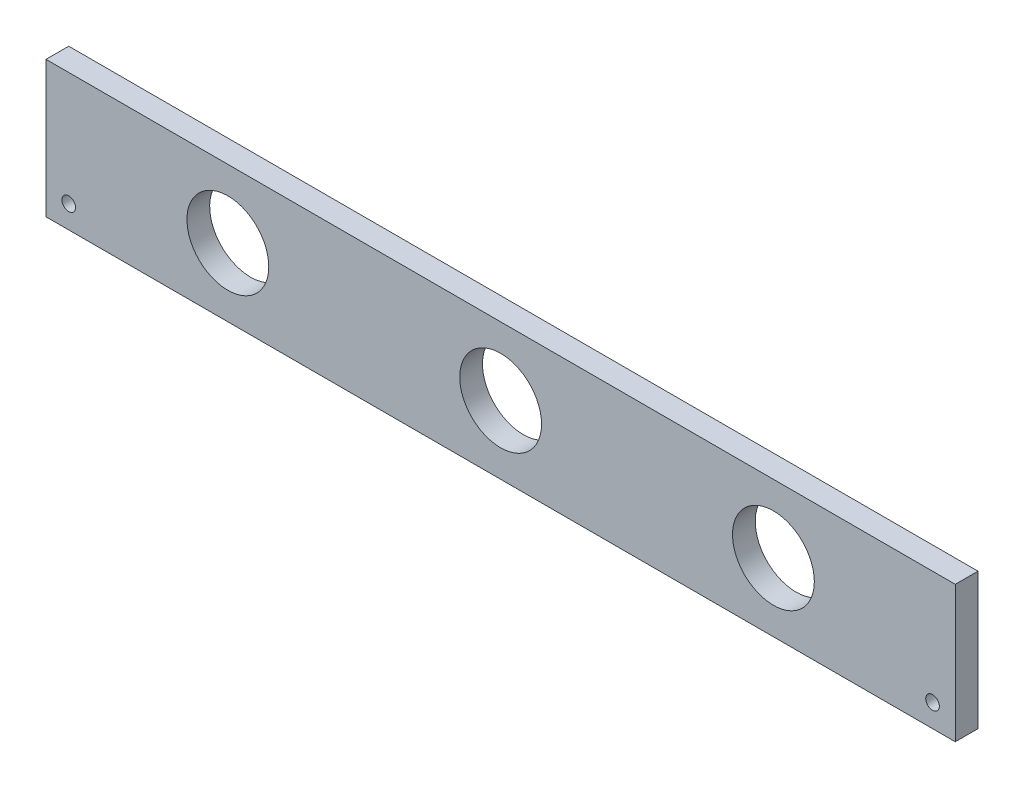
ISO-10303-21;
HEADER;
FILE_DESCRIPTION(('STEP AP214'),'2;1');
FILE_NAME('part.step','',(''),(''),'','','');
FILE_SCHEMA(('AUTOMOTIVE_DESIGN { 1 0 10303 214 1 1 1 1 }'));
ENDSEC;
DATA;
#1=APPLICATION_CONTEXT('core data for automotive mechanical design processes');
#2=APPLICATION_PROTOCOL_DEFINITION('international standard','automotive_design',2000,#1);
#3=PRODUCT_CONTEXT('',#1,'mechanical');
#4=PRODUCT('Part','Part','',(#3));
#5=PRODUCT_RELATED_PRODUCT_CATEGORY('part','',(#4));
#6=PRODUCT_DEFINITION_FORMATION('','',#4);
#7=PRODUCT_DEFINITION_CONTEXT('part definition',#1,'design');
#8=PRODUCT_DEFINITION('design','',#6,#7);
#9=PRODUCT_DEFINITION_SHAPE('','',#8);
#10=(LENGTH_UNIT() NAMED_UNIT(*) SI_UNIT(.MILLI.,.METRE.));
#11=(NAMED_UNIT(*) PLANE_ANGLE_UNIT() SI_UNIT($,.RADIAN.));
#12=(NAMED_UNIT(*) SI_UNIT($,.STERADIAN.) SOLID_ANGLE_UNIT());
#13=UNCERTAINTY_MEASURE_WITH_UNIT(LENGTH_MEASURE(1.E-05),#10,'distance_accuracy_value','');
#14=(GEOMETRIC_REPRESENTATION_CONTEXT(3) GLOBAL_UNCERTAINTY_ASSIGNED_CONTEXT((#13)) GLOBAL_UNIT_ASSIGNED_CONTEXT((#10,
#11,#12)) REPRESENTATION_CONTEXT('',''));
#15=CARTESIAN_POINT('',(0.,0.,0.));
#16=DIRECTION('',(0.,0.,1.));
#17=DIRECTION('',(1.,0.,0.));
#18=AXIS2_PLACEMENT_3D('',#15,#16,#17);
#19=CARTESIAN_POINT('',(100.,0.,-5.));
#20=DIRECTION('',(0.,0.,1.));
#21=DIRECTION('',(0.,-1.,0.));
#22=AXIS2_PLACEMENT_3D('',#19,#20,#21);
#23=PLANE('',#22);
#24=CARTESIAN_POINT('',(95.,5.,-5.));
#25=DIRECTION('',(0.,0.,1.));
#26=DIRECTION('',(0.,-1.,0.));
#27=AXIS2_PLACEMENT_3D('',#24,#25,#26);
#28=CIRCLE('',#27,1.5);
#29=CARTESIAN_POINT('',(95.,3.5,-5.));
#30=VERTEX_POINT('',#29);
#31=EDGE_CURVE('E133',#30,#30,#28,.T.);
#32=ORIENTED_EDGE('',*,*,#31,.T.);
#33=EDGE_LOOP('',(#32));
#34=FACE_BOUND('',#33,.T.);
#35=CARTESIAN_POINT('',(-95.,5.,-5.));
#36=DIRECTION('',(0.,0.,1.));
#37=DIRECTION('',(0.,-1.,0.));
#38=AXIS2_PLACEMENT_3D('',#35,#36,#37);
#39=CIRCLE('',#38,1.5);
#40=CARTESIAN_POINT('',(-95.,3.5,-5.));
#41=VERTEX_POINT('',#40);
#42=EDGE_CURVE('E127',#41,#41,#39,.T.);
#43=ORIENTED_EDGE('',*,*,#42,.T.);
#44=EDGE_LOOP('',(#43));
#45=FACE_BOUND('',#44,.T.);
#46=CARTESIAN_POINT('',(-60.,15.,-5.));
#47=DIRECTION('',(0.,0.,1.));
#48=DIRECTION('',(0.,-1.,0.));
#49=AXIS2_PLACEMENT_3D('',#46,#47,#48);
#50=CIRCLE('',#49,9.);
#51=CARTESIAN_POINT('',(-60.,6.,-5.));
#52=VERTEX_POINT('',#51);
#53=EDGE_CURVE('E121',#52,#52,#50,.T.);
#54=ORIENTED_EDGE('',*,*,#53,.T.);
#55=EDGE_LOOP('',(#54));
#56=FACE_BOUND('',#55,.T.);
#57=CARTESIAN_POINT('',(60.,15.,-5.));
#58=DIRECTION('',(0.,0.,1.));
#59=DIRECTION('',(0.,-1.,0.));
#60=AXIS2_PLACEMENT_3D('',#57,#58,#59);
#61=CIRCLE('',#60,9.);
#62=CARTESIAN_POINT('',(60.,6.,-5.));
#63=VERTEX_POINT('',#62);
#64=EDGE_CURVE('E115',#63,#63,#61,.T.);
#65=ORIENTED_EDGE('',*,*,#64,.T.);
#66=EDGE_LOOP('',(#65));
#67=FACE_BOUND('',#66,.T.);
#68=CARTESIAN_POINT('',(0.,15.,-5.));
#69=DIRECTION('',(0.,0.,1.));
#70=DIRECTION('',(0.,-1.,0.));
#71=AXIS2_PLACEMENT_3D('',#68,#69,#70);
#72=CIRCLE('',#71,9.);
#73=CARTESIAN_POINT('',(0.,6.,-5.));
#74=VERTEX_POINT('',#73);
#75=EDGE_CURVE('E99',#74,#74,#72,.T.);
#76=ORIENTED_EDGE('',*,*,#75,.T.);
#77=EDGE_LOOP('',(#76));
#78=FACE_BOUND('',#77,.T.);
#79=DIRECTION('',(0.,1.,0.));
#80=VECTOR('',#79,1.);
#81=CARTESIAN_POINT('',(-100.,0.,-5.));
#82=LINE('',#81,#80);
#83=CARTESIAN_POINT('',(-100.,0.,-5.));
#84=VERTEX_POINT('',#83);
#85=CARTESIAN_POINT('',(-100.,30.,-5.));
#86=VERTEX_POINT('',#85);
#87=EDGE_CURVE('E96',#84,#86,#82,.T.);
#88=ORIENTED_EDGE('',*,*,#87,.T.);
#89=DIRECTION('',(-1.,0.,0.));
#90=VECTOR('',#89,1.);
#91=CARTESIAN_POINT('',(100.,30.,-5.));
#92=LINE('',#91,#90);
#93=CARTESIAN_POINT('',(100.,30.,-5.));
#94=VERTEX_POINT('',#93);
#95=EDGE_CURVE('E11',#94,#86,#92,.T.);
#96=ORIENTED_EDGE('',*,*,#95,.F.);
#97=DIRECTION('',(0.,1.,0.));
#98=VECTOR('',#97,1.);
#99=CARTESIAN_POINT('',(100.,0.,-5.));
#100=LINE('',#99,#98);
#101=CARTESIAN_POINT('',(100.,0.,-5.));
#102=VERTEX_POINT('',#101);
#103=EDGE_CURVE('E84',#102,#94,#100,.T.);
#104=ORIENTED_EDGE('',*,*,#103,.F.);
#105=DIRECTION('',(-1.,0.,0.));
#106=VECTOR('',#105,1.);
#107=CARTESIAN_POINT('',(100.,0.,-5.));
#108=LINE('',#107,#106);
#109=EDGE_CURVE('E92',#102,#84,#108,.T.);
#110=ORIENTED_EDGE('',*,*,#109,.T.);
#111=EDGE_LOOP('',(#88,#96,#104,#110));
#112=FACE_BOUND('',#111,.T.);
#113=ADVANCED_FACE('F33',(#34,#45,#56,#67,#78,#112),#23,.F.);
#114=CARTESIAN_POINT('',(100.,30.,-5.));
#115=DIRECTION('',(0.,-1.,0.));
#116=DIRECTION('',(0.,0.,-1.));
#117=AXIS2_PLACEMENT_3D('',#114,#115,#116);
#118=PLANE('',#117);
#119=DIRECTION('',(0.,0.,1.));
#120=VECTOR('',#119,1.);
#121=CARTESIAN_POINT('',(-100.,30.,-5.));
#122=LINE('',#121,#120);
#123=CARTESIAN_POINT('',(-100.,30.,0.));
#124=VERTEX_POINT('',#123);
#125=EDGE_CURVE('E88',#86,#124,#122,.T.);
#126=ORIENTED_EDGE('',*,*,#125,.T.);
#127=DIRECTION('',(-1.,0.,0.));
#128=VECTOR('',#127,1.);
#129=CARTESIAN_POINT('',(100.,30.,0.));
#130=LINE('',#129,#128);
#131=CARTESIAN_POINT('',(100.,30.,0.));
#132=VERTEX_POINT('',#131);
#133=EDGE_CURVE('E41',#132,#124,#130,.T.);
#134=ORIENTED_EDGE('',*,*,#133,.F.);
#135=DIRECTION('',(0.,0.,1.));
#136=VECTOR('',#135,1.);
#137=CARTESIAN_POINT('',(100.,30.,-5.));
#138=LINE('',#137,#136);
#139=EDGE_CURVE('E79',#94,#132,#138,.T.);
#140=ORIENTED_EDGE('',*,*,#139,.F.);
#141=ORIENTED_EDGE('',*,*,#95,.T.);
#142=EDGE_LOOP('',(#126,#134,#140,#141));
#143=FACE_BOUND('',#142,.T.);
#144=ADVANCED_FACE('F87',(#143),#118,.F.);
#145=CARTESIAN_POINT('',(100.,30.,0.));
#146=DIRECTION('',(0.,0.,-1.));
#147=DIRECTION('',(-1.,0.,0.));
#148=AXIS2_PLACEMENT_3D('',#145,#146,#147);
#149=PLANE('',#148);
#150=CARTESIAN_POINT('',(95.,5.,0.));
#151=DIRECTION('',(0.,0.,1.));
#152=DIRECTION('',(1.,0.,0.));
#153=AXIS2_PLACEMENT_3D('',#150,#151,#152);
#154=CIRCLE('',#153,1.5);
#155=CARTESIAN_POINT('',(96.5,5.,0.));
#156=VERTEX_POINT('',#155);
#157=EDGE_CURVE('E136',#156,#156,#154,.T.);
#158=ORIENTED_EDGE('',*,*,#157,.F.);
#159=EDGE_LOOP('',(#158));
#160=FACE_BOUND('',#159,.T.);
#161=CARTESIAN_POINT('',(-95.,5.,0.));
#162=DIRECTION('',(0.,0.,1.));
#163=DIRECTION('',(1.,0.,0.));
#164=AXIS2_PLACEMENT_3D('',#161,#162,#163);
#165=CIRCLE('',#164,1.5);
#166=CARTESIAN_POINT('',(-93.5,5.,0.));
#167=VERTEX_POINT('',#166);
#168=EDGE_CURVE('E130',#167,#167,#165,.T.);
#169=ORIENTED_EDGE('',*,*,#168,.F.);
#170=EDGE_LOOP('',(#169));
#171=FACE_BOUND('',#170,.T.);
#172=CARTESIAN_POINT('',(-60.,15.,0.));
#173=DIRECTION('',(0.,0.,1.));
#174=DIRECTION('',(1.,0.,0.));
#175=AXIS2_PLACEMENT_3D('',#172,#173,#174);
#176=CIRCLE('',#175,9.);
#177=CARTESIAN_POINT('',(-51.,15.,0.));
#178=VERTEX_POINT('',#177);
#179=EDGE_CURVE('E124',#178,#178,#176,.T.);
#180=ORIENTED_EDGE('',*,*,#179,.F.);
#181=EDGE_LOOP('',(#180));
#182=FACE_BOUND('',#181,.T.);
#183=CARTESIAN_POINT('',(60.,15.,0.));
#184=DIRECTION('',(0.,0.,1.));
#185=DIRECTION('',(1.,0.,0.));
#186=AXIS2_PLACEMENT_3D('',#183,#184,#185);
#187=CIRCLE('',#186,9.);
#188=CARTESIAN_POINT('',(69.,15.,0.));
#189=VERTEX_POINT('',#188);
#190=EDGE_CURVE('E118',#189,#189,#187,.T.);
#191=ORIENTED_EDGE('',*,*,#190,.F.);
#192=EDGE_LOOP('',(#191));
#193=FACE_BOUND('',#192,.T.);
#194=CARTESIAN_POINT('',(0.,15.,0.));
#195=DIRECTION('',(0.,0.,1.));
#196=DIRECTION('',(1.,0.,0.));
#197=AXIS2_PLACEMENT_3D('',#194,#195,#196);
#198=CIRCLE('',#197,9.);
#199=CARTESIAN_POINT('',(9.,15.,0.));
#200=VERTEX_POINT('',#199);
#201=EDGE_CURVE('E112',#200,#200,#198,.T.);
#202=ORIENTED_EDGE('',*,*,#201,.F.);
#203=EDGE_LOOP('',(#202));
#204=FACE_BOUND('',#203,.T.);
#205=DIRECTION('',(0.,-1.,0.));
#206=VECTOR('',#205,1.);
#207=CARTESIAN_POINT('',(-100.,30.,0.));
#208=LINE('',#207,#206);
#209=CARTESIAN_POINT('',(-100.,0.,0.));
#210=VERTEX_POINT('',#209);
#211=EDGE_CURVE('E66',#124,#210,#208,.T.);
#212=ORIENTED_EDGE('',*,*,#211,.T.);
#213=DIRECTION('',(-1.,0.,0.));
#214=VECTOR('',#213,1.);
#215=CARTESIAN_POINT('',(100.,0.,0.));
#216=LINE('',#215,#214);
#217=CARTESIAN_POINT('',(100.,0.,0.));
#218=VERTEX_POINT('',#217);
#219=EDGE_CURVE('E89',#218,#210,#216,.T.);
#220=ORIENTED_EDGE('',*,*,#219,.F.);
#221=DIRECTION('',(0.,-1.,0.));
#222=VECTOR('',#221,1.);
#223=CARTESIAN_POINT('',(100.,30.,0.));
#224=LINE('',#223,#222);
#225=EDGE_CURVE('E82',#132,#218,#224,.T.);
#226=ORIENTED_EDGE('',*,*,#225,.F.);
#227=ORIENTED_EDGE('',*,*,#133,.T.);
#228=EDGE_LOOP('',(#212,#220,#226,#227));
#229=FACE_BOUND('',#228,.T.);
#230=ADVANCED_FACE('F90',(#160,#171,#182,#193,#204,#229),#149,.F.);
#231=CARTESIAN_POINT('',(100.,0.,-5.));
#232=DIRECTION('',(0.,1.,0.));
#233=DIRECTION('',(0.,0.,1.));
#234=AXIS2_PLACEMENT_3D('',#231,#232,#233);
#235=PLANE('',#234);
#236=DIRECTION('',(0.,0.,-1.));
#237=VECTOR('',#236,1.);
#238=CARTESIAN_POINT('',(-100.,0.,-5.));
#239=LINE('',#238,#237);
#240=EDGE_CURVE('E72',#210,#84,#239,.T.);
#241=ORIENTED_EDGE('',*,*,#240,.T.);
#242=ORIENTED_EDGE('',*,*,#109,.F.);
#243=DIRECTION('',(0.,0.,-1.));
#244=VECTOR('',#243,1.);
#245=CARTESIAN_POINT('',(100.,0.,-5.));
#246=LINE('',#245,#244);
#247=EDGE_CURVE('E49',#218,#102,#246,.T.);
#248=ORIENTED_EDGE('',*,*,#247,.F.);
#249=ORIENTED_EDGE('',*,*,#219,.T.);
#250=EDGE_LOOP('',(#241,#242,#248,#249));
#251=FACE_BOUND('',#250,.T.);
#252=ADVANCED_FACE('F104',(#251),#235,.F.);
#253=CARTESIAN_POINT('',(100.,0.,0.));
#254=DIRECTION('',(1.,0.,0.));
#255=DIRECTION('',(0.,0.,-1.));
#256=AXIS2_PLACEMENT_3D('',#253,#254,#255);
#257=PLANE('',#256);
#258=ORIENTED_EDGE('',*,*,#103,.T.);
#259=ORIENTED_EDGE('',*,*,#139,.T.);
#260=ORIENTED_EDGE('',*,*,#225,.T.);
#261=ORIENTED_EDGE('',*,*,#247,.T.);
#262=EDGE_LOOP('',(#258,#259,#260,#261));
#263=FACE_BOUND('',#262,.T.);
#264=ADVANCED_FACE('F80',(#263),#257,.T.);
#265=CARTESIAN_POINT('',(-100.,0.,0.));
#266=DIRECTION('',(1.,0.,0.));
#267=DIRECTION('',(0.,0.,-1.));
#268=AXIS2_PLACEMENT_3D('',#265,#266,#267);
#269=PLANE('',#268);
#270=ORIENTED_EDGE('',*,*,#87,.F.);
#271=ORIENTED_EDGE('',*,*,#240,.F.);
#272=ORIENTED_EDGE('',*,*,#211,.F.);
#273=ORIENTED_EDGE('',*,*,#125,.F.);
#274=EDGE_LOOP('',(#270,#271,#272,#273));
#275=FACE_BOUND('',#274,.T.);
#276=ADVANCED_FACE('F107',(#275),#269,.F.);
#277=CARTESIAN_POINT('',(0.,15.,-10.));
#278=DIRECTION('',(0.,0.,1.));
#279=DIRECTION('',(1.,0.,0.));
#280=AXIS2_PLACEMENT_3D('',#277,#278,#279);
#281=CYLINDRICAL_SURFACE('',#280,9.);
#282=ORIENTED_EDGE('',*,*,#201,.T.);
#283=EDGE_LOOP('',(#282));
#284=FACE_BOUND('',#283,.T.);
#285=ORIENTED_EDGE('',*,*,#75,.F.);
#286=EDGE_LOOP('',(#285));
#287=FACE_BOUND('',#286,.T.);
#288=ADVANCED_FACE('F154',(#284,#287),#281,.F.);
#289=CARTESIAN_POINT('',(60.,15.,-10.));
#290=DIRECTION('',(0.,0.,1.));
#291=DIRECTION('',(1.,0.,0.));
#292=AXIS2_PLACEMENT_3D('',#289,#290,#291);
#293=CYLINDRICAL_SURFACE('',#292,9.);
#294=ORIENTED_EDGE('',*,*,#190,.T.);
#295=EDGE_LOOP('',(#294));
#296=FACE_BOUND('',#295,.T.);
#297=ORIENTED_EDGE('',*,*,#64,.F.);
#298=EDGE_LOOP('',(#297));
#299=FACE_BOUND('',#298,.T.);
#300=ADVANCED_FACE('F157',(#296,#299),#293,.F.);
#301=CARTESIAN_POINT('',(-60.,15.,-10.));
#302=DIRECTION('',(0.,0.,1.));
#303=DIRECTION('',(1.,0.,0.));
#304=AXIS2_PLACEMENT_3D('',#301,#302,#303);
#305=CYLINDRICAL_SURFACE('',#304,9.);
#306=ORIENTED_EDGE('',*,*,#179,.T.);
#307=EDGE_LOOP('',(#306));
#308=FACE_BOUND('',#307,.T.);
#309=ORIENTED_EDGE('',*,*,#53,.F.);
#310=EDGE_LOOP('',(#309));
#311=FACE_BOUND('',#310,.T.);
#312=ADVANCED_FACE('F175',(#308,#311),#305,.F.);
#313=CARTESIAN_POINT('',(-95.,5.,-10.));
#314=DIRECTION('',(0.,0.,1.));
#315=DIRECTION('',(1.,0.,0.));
#316=AXIS2_PLACEMENT_3D('',#313,#314,#315);
#317=CYLINDRICAL_SURFACE('',#316,1.5);
#318=ORIENTED_EDGE('',*,*,#168,.T.);
#319=EDGE_LOOP('',(#318));
#320=FACE_BOUND('',#319,.T.);
#321=ORIENTED_EDGE('',*,*,#42,.F.);
#322=EDGE_LOOP('',(#321));
#323=FACE_BOUND('',#322,.T.);
#324=ADVANCED_FACE('F181',(#320,#323),#317,.F.);
#325=CARTESIAN_POINT('',(95.,5.,-10.));
#326=DIRECTION('',(0.,0.,1.));
#327=DIRECTION('',(1.,0.,0.));
#328=AXIS2_PLACEMENT_3D('',#325,#326,#327);
#329=CYLINDRICAL_SURFACE('',#328,1.5);
#330=ORIENTED_EDGE('',*,*,#157,.T.);
#331=EDGE_LOOP('',(#330));
#332=FACE_BOUND('',#331,.T.);
#333=ORIENTED_EDGE('',*,*,#31,.F.);
#334=EDGE_LOOP('',(#333));
#335=FACE_BOUND('',#334,.T.);
#336=ADVANCED_FACE('F140',(#332,#335),#329,.F.);
#337=CLOSED_SHELL('',(#113,#144,#230,#252,#264,#276,#288,#300,#312,#324,#336));
#338=MANIFOLD_SOLID_BREP('B2',#337);
#339=ADVANCED_BREP_SHAPE_REPRESENTATION('',(#18,#338),#14);
#340=SHAPE_DEFINITION_REPRESENTATION(#9,#339);
ENDSEC;
END-ISO-10303-21;
